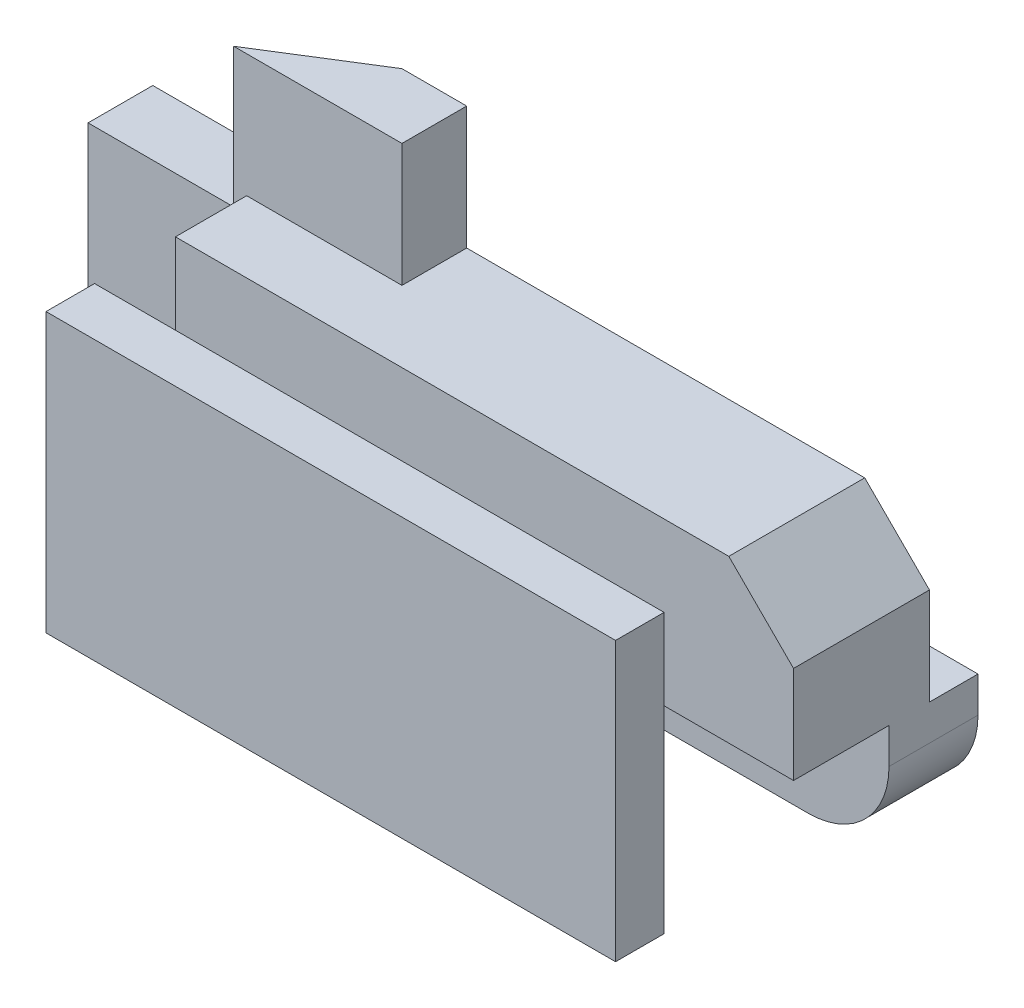
ISO-10303-21;
HEADER;
FILE_DESCRIPTION(('STEP AP214'),'2;1');
FILE_NAME('part.step','',(''),(''),'','','');
FILE_SCHEMA(('AUTOMOTIVE_DESIGN { 1 0 10303 214 1 1 1 1 }'));
ENDSEC;
DATA;
#1=APPLICATION_CONTEXT('core data for automotive mechanical design processes');
#2=APPLICATION_PROTOCOL_DEFINITION('international standard','automotive_design',2000,#1);
#3=PRODUCT_CONTEXT('',#1,'mechanical');
#4=PRODUCT('Part','Part','',(#3));
#5=PRODUCT_RELATED_PRODUCT_CATEGORY('part','',(#4));
#6=PRODUCT_DEFINITION_FORMATION('','',#4);
#7=PRODUCT_DEFINITION_CONTEXT('part definition',#1,'design');
#8=PRODUCT_DEFINITION('design','',#6,#7);
#9=PRODUCT_DEFINITION_SHAPE('','',#8);
#10=(LENGTH_UNIT() NAMED_UNIT(*) SI_UNIT(.MILLI.,.METRE.));
#11=(NAMED_UNIT(*) PLANE_ANGLE_UNIT() SI_UNIT($,.RADIAN.));
#12=(NAMED_UNIT(*) SI_UNIT($,.STERADIAN.) SOLID_ANGLE_UNIT());
#13=UNCERTAINTY_MEASURE_WITH_UNIT(LENGTH_MEASURE(1.E-05),#10,'distance_accuracy_value','');
#14=(GEOMETRIC_REPRESENTATION_CONTEXT(3) GLOBAL_UNCERTAINTY_ASSIGNED_CONTEXT((#13)) GLOBAL_UNIT_ASSIGNED_CONTEXT((#10,
#11,#12)) REPRESENTATION_CONTEXT('',''));
#15=CARTESIAN_POINT('',(0.,0.,0.));
#16=DIRECTION('',(0.,0.,1.));
#17=DIRECTION('',(1.,0.,0.));
#18=AXIS2_PLACEMENT_3D('',#15,#16,#17);
#19=CARTESIAN_POINT('',(0.,0.,4.2));
#20=DIRECTION('',(0.,0.,-1.));
#21=DIRECTION('',(-1.,0.,0.));
#22=AXIS2_PLACEMENT_3D('',#19,#20,#21);
#23=PLANE('',#22);
#24=DIRECTION('',(0.,-1.,0.));
#25=VECTOR('',#24,1.);
#26=CARTESIAN_POINT('',(7.74,1.5,4.2));
#27=LINE('',#26,#25);
#28=CARTESIAN_POINT('',(7.74,4.,4.2));
#29=VERTEX_POINT('',#28);
#30=CARTESIAN_POINT('',(7.74,1.5,4.2));
#31=VERTEX_POINT('',#30);
#32=EDGE_CURVE('E57',#29,#31,#27,.T.);
#33=ORIENTED_EDGE('',*,*,#32,.F.);
#34=DIRECTION('',(-1.,0.,0.));
#35=VECTOR('',#34,1.);
#36=CARTESIAN_POINT('',(7.74,4.,4.2));
#37=LINE('',#36,#35);
#38=CARTESIAN_POINT('',(16.94,4.,4.2));
#39=VERTEX_POINT('',#38);
#40=EDGE_CURVE('E255',#39,#29,#37,.T.);
#41=ORIENTED_EDGE('',*,*,#40,.F.);
#42=DIRECTION('',(0.,1.,0.));
#43=VECTOR('',#42,1.);
#44=CARTESIAN_POINT('',(16.94,1.5,4.2));
#45=LINE('',#44,#43);
#46=CARTESIAN_POINT('',(16.94,1.5,4.2));
#47=VERTEX_POINT('',#46);
#48=EDGE_CURVE('E245',#47,#39,#45,.T.);
#49=ORIENTED_EDGE('',*,*,#48,.F.);
#50=DIRECTION('',(-1.,0.,0.));
#51=VECTOR('',#50,1.);
#52=CARTESIAN_POINT('',(0.,1.5,4.2));
#53=LINE('',#52,#51);
#54=CARTESIAN_POINT('',(24.,1.5,4.2));
#55=VERTEX_POINT('',#54);
#56=EDGE_CURVE('E340',#55,#47,#53,.T.);
#57=ORIENTED_EDGE('',*,*,#56,.F.);
#58=DIRECTION('',(0.,-1.,0.));
#59=VECTOR('',#58,1.);
#60=CARTESIAN_POINT('',(24.,0.,4.2));
#61=LINE('',#60,#59);
#62=CARTESIAN_POINT('',(24.,4.49999999999999,4.2));
#63=VERTEX_POINT('',#62);
#64=EDGE_CURVE('E377',#63,#55,#61,.T.);
#65=ORIENTED_EDGE('',*,*,#64,.F.);
#66=DIRECTION('',(0.707106781186546,-0.707106781186549,0.));
#67=VECTOR('',#66,1.);
#68=CARTESIAN_POINT('',(22.,6.5,4.2));
#69=LINE('',#68,#67);
#70=CARTESIAN_POINT('',(22.,6.5,4.2));
#71=VERTEX_POINT('',#70);
#72=EDGE_CURVE('E12',#63,#71,#69,.F.);
#73=ORIENTED_EDGE('',*,*,#72,.T.);
#74=DIRECTION('',(1.,0.,0.));
#75=VECTOR('',#74,1.);
#76=CARTESIAN_POINT('',(4.5,6.5,4.2));
#77=LINE('',#76,#75);
#78=CARTESIAN_POINT('',(4.9,6.5,4.2));
#79=VERTEX_POINT('',#78);
#80=EDGE_CURVE('E374',#79,#71,#77,.T.);
#81=ORIENTED_EDGE('',*,*,#80,.F.);
#82=DIRECTION('',(0.,1.,0.));
#83=VECTOR('',#82,1.);
#84=CARTESIAN_POINT('',(4.9,1.5,4.2));
#85=LINE('',#84,#83);
#86=CARTESIAN_POINT('',(4.9,1.5,4.2));
#87=VERTEX_POINT('',#86);
#88=EDGE_CURVE('E278',#87,#79,#85,.T.);
#89=ORIENTED_EDGE('',*,*,#88,.F.);
#90=EDGE_CURVE('E62',#31,#87,#53,.T.);
#91=ORIENTED_EDGE('',*,*,#90,.F.);
#92=EDGE_LOOP('',(#33,#41,#49,#57,#65,#73,#81,#89,#91));
#93=FACE_BOUND('',#92,.T.);
#94=ADVANCED_FACE('F41',(#93),#23,.F.);
#95=CARTESIAN_POINT('',(0.,0.,2.));
#96=DIRECTION('',(0.,1.,0.));
#97=DIRECTION('',(0.,0.,1.));
#98=AXIS2_PLACEMENT_3D('',#95,#96,#97);
#99=PLANE('',#98);
#100=DIRECTION('',(0.,0.,-1.));
#101=VECTOR('',#100,1.);
#102=CARTESIAN_POINT('',(14.,0.,14.4181211580212));
#103=LINE('',#102,#101);
#104=CARTESIAN_POINT('',(14.,0.,1.25));
#105=VERTEX_POINT('',#104);
#106=CARTESIAN_POINT('',(14.,0.,0.));
#107=VERTEX_POINT('',#106);
#108=EDGE_CURVE('E369',#105,#107,#103,.T.);
#109=ORIENTED_EDGE('',*,*,#108,.F.);
#110=DIRECTION('',(-1.,0.,0.));
#111=VECTOR('',#110,1.);
#112=CARTESIAN_POINT('',(0.,0.,1.25));
#113=LINE('',#112,#111);
#114=CARTESIAN_POINT('',(0.,0.,1.25));
#115=VERTEX_POINT('',#114);
#116=EDGE_CURVE('E358',#105,#115,#113,.T.);
#117=ORIENTED_EDGE('',*,*,#116,.T.);
#118=DIRECTION('',(0.,0.,-1.));
#119=VECTOR('',#118,1.);
#120=CARTESIAN_POINT('',(0.,0.,2.));
#121=LINE('',#120,#119);
#122=CARTESIAN_POINT('',(0.,0.,0.));
#123=VERTEX_POINT('',#122);
#124=EDGE_CURVE('E399',#115,#123,#121,.T.);
#125=ORIENTED_EDGE('',*,*,#124,.T.);
#126=DIRECTION('',(1.,0.,0.));
#127=VECTOR('',#126,1.);
#128=CARTESIAN_POINT('',(0.,0.,0.));
#129=LINE('',#128,#127);
#130=EDGE_CURVE('E393',#123,#107,#129,.T.);
#131=ORIENTED_EDGE('',*,*,#130,.T.);
#132=EDGE_LOOP('',(#109,#117,#125,#131));
#133=FACE_BOUND('',#132,.T.);
#134=ADVANCED_FACE('F495',(#133),#99,.F.);
#135=CARTESIAN_POINT('',(0.,0.,2.));
#136=DIRECTION('',(1.,0.,0.));
#137=DIRECTION('',(0.,0.,-1.));
#138=AXIS2_PLACEMENT_3D('',#135,#136,#137);
#139=PLANE('',#138);
#140=ORIENTED_EDGE('',*,*,#124,.F.);
#141=DIRECTION('',(0.,-1.,0.));
#142=VECTOR('',#141,1.);
#143=CARTESIAN_POINT('',(0.,1.5,1.25));
#144=LINE('',#143,#142);
#145=CARTESIAN_POINT('',(0.,1.5,1.25));
#146=VERTEX_POINT('',#145);
#147=EDGE_CURVE('E344',#146,#115,#144,.T.);
#148=ORIENTED_EDGE('',*,*,#147,.F.);
#149=DIRECTION('',(0.,0.,1.));
#150=VECTOR('',#149,1.);
#151=CARTESIAN_POINT('',(0.,1.5,-24.268498099388));
#152=LINE('',#151,#150);
#153=CARTESIAN_POINT('',(0.,1.5,2.));
#154=VERTEX_POINT('',#153);
#155=EDGE_CURVE('E347',#146,#154,#152,.T.);
#156=ORIENTED_EDGE('',*,*,#155,.T.);
#157=DIRECTION('',(0.,-1.,0.));
#158=VECTOR('',#157,1.);
#159=CARTESIAN_POINT('',(0.,0.,2.));
#160=LINE('',#159,#158);
#161=CARTESIAN_POINT('',(0.,6.,2.));
#162=VERTEX_POINT('',#161);
#163=EDGE_CURVE('E384',#162,#154,#160,.T.);
#164=ORIENTED_EDGE('',*,*,#163,.F.);
#165=DIRECTION('',(0.,0.,-1.));
#166=VECTOR('',#165,1.);
#167=CARTESIAN_POINT('',(0.,6.,2.));
#168=LINE('',#167,#166);
#169=CARTESIAN_POINT('',(0.,6.,0.));
#170=VERTEX_POINT('',#169);
#171=EDGE_CURVE('E390',#162,#170,#168,.T.);
#172=ORIENTED_EDGE('',*,*,#171,.T.);
#173=DIRECTION('',(0.,-1.,0.));
#174=VECTOR('',#173,1.);
#175=CARTESIAN_POINT('',(0.,0.,0.));
#176=LINE('',#175,#174);
#177=EDGE_CURVE('E380',#170,#123,#176,.T.);
#178=ORIENTED_EDGE('',*,*,#177,.T.);
#179=EDGE_LOOP('',(#140,#148,#156,#164,#172,#178));
#180=FACE_BOUND('',#179,.T.);
#181=ADVANCED_FACE('F499',(#180),#139,.F.);
#182=CARTESIAN_POINT('',(0.,6.,2.));
#183=DIRECTION('',(0.,-1.,0.));
#184=DIRECTION('',(0.,0.,-1.));
#185=AXIS2_PLACEMENT_3D('',#182,#183,#184);
#186=PLANE('',#185);
#187=DIRECTION('',(-1.,0.,0.));
#188=VECTOR('',#187,1.);
#189=CARTESIAN_POINT('',(0.,6.,0.));
#190=LINE('',#189,#188);
#191=CARTESIAN_POINT('',(7.7,6.,0.));
#192=VERTEX_POINT('',#191);
#193=EDGE_CURVE('E388',#192,#170,#190,.T.);
#194=ORIENTED_EDGE('',*,*,#193,.T.);
#195=ORIENTED_EDGE('',*,*,#171,.F.);
#196=DIRECTION('',(-1.,0.,0.));
#197=VECTOR('',#196,1.);
#198=CARTESIAN_POINT('',(0.,6.,2.));
#199=LINE('',#198,#197);
#200=CARTESIAN_POINT('',(4.5,6.,2.));
#201=VERTEX_POINT('',#200);
#202=EDGE_CURVE('E387',#201,#162,#199,.T.);
#203=ORIENTED_EDGE('',*,*,#202,.F.);
#204=DIRECTION('',(0.847998304005088,0.,-0.52999894000318));
#205=VECTOR('',#204,1.);
#206=CARTESIAN_POINT('',(4.5,6.,2.));
#207=LINE('',#206,#205);
#208=EDGE_CURVE('E290',#201,#192,#207,.T.);
#209=ORIENTED_EDGE('',*,*,#208,.T.);
#210=EDGE_LOOP('',(#194,#195,#203,#209));
#211=FACE_BOUND('',#210,.T.);
#212=ADVANCED_FACE('F505',(#211),#186,.F.);
#213=CARTESIAN_POINT('',(0.,0.,2.));
#214=DIRECTION('',(0.,0.,-1.));
#215=DIRECTION('',(-1.,0.,0.));
#216=AXIS2_PLACEMENT_3D('',#213,#214,#215);
#217=PLANE('',#216);
#218=ORIENTED_EDGE('',*,*,#163,.T.);
#219=DIRECTION('',(1.,0.,0.));
#220=VECTOR('',#219,1.);
#221=CARTESIAN_POINT('',(0.,1.5,2.));
#222=LINE('',#221,#220);
#223=CARTESIAN_POINT('',(4.9,1.5,2.));
#224=VERTEX_POINT('',#223);
#225=EDGE_CURVE('E361',#154,#224,#222,.T.);
#226=ORIENTED_EDGE('',*,*,#225,.T.);
#227=DIRECTION('',(0.,1.,0.));
#228=VECTOR('',#227,1.);
#229=CARTESIAN_POINT('',(4.9,1.5,2.));
#230=LINE('',#229,#228);
#231=CARTESIAN_POINT('',(4.9,6.5,2.));
#232=VERTEX_POINT('',#231);
#233=EDGE_CURVE('E281',#224,#232,#230,.T.);
#234=ORIENTED_EDGE('',*,*,#233,.T.);
#235=DIRECTION('',(-1.,0.,0.));
#236=VECTOR('',#235,1.);
#237=CARTESIAN_POINT('',(4.5,6.5,2.));
#238=LINE('',#237,#236);
#239=CARTESIAN_POINT('',(9.7,6.5,2.));
#240=VERTEX_POINT('',#239);
#241=EDGE_CURVE('E305',#240,#232,#238,.T.);
#242=ORIENTED_EDGE('',*,*,#241,.F.);
#243=DIRECTION('',(0.,-1.,0.));
#244=VECTOR('',#243,1.);
#245=CARTESIAN_POINT('',(9.7,6.5,2.));
#246=LINE('',#245,#244);
#247=CARTESIAN_POINT('',(9.7,10.3,2.));
#248=VERTEX_POINT('',#247);
#249=EDGE_CURVE('E303',#248,#240,#246,.T.);
#250=ORIENTED_EDGE('',*,*,#249,.F.);
#251=DIRECTION('',(1.,0.,0.));
#252=VECTOR('',#251,1.);
#253=CARTESIAN_POINT('',(4.5,10.3,2.));
#254=LINE('',#253,#252);
#255=CARTESIAN_POINT('',(4.5,10.3,2.));
#256=VERTEX_POINT('',#255);
#257=EDGE_CURVE('E299',#256,#248,#254,.T.);
#258=ORIENTED_EDGE('',*,*,#257,.F.);
#259=DIRECTION('',(0.,1.,0.));
#260=VECTOR('',#259,1.);
#261=CARTESIAN_POINT('',(4.5,6.5,2.));
#262=LINE('',#261,#260);
#263=EDGE_CURVE('E297',#201,#256,#262,.T.);
#264=ORIENTED_EDGE('',*,*,#263,.F.);
#265=ORIENTED_EDGE('',*,*,#202,.T.);
#266=EDGE_LOOP('',(#218,#226,#234,#242,#250,#258,#264,#265));
#267=FACE_BOUND('',#266,.T.);
#268=ADVANCED_FACE('F442',(#267),#217,.F.);
#269=CARTESIAN_POINT('',(0.,0.,0.));
#270=DIRECTION('',(0.,0.,-1.));
#271=DIRECTION('',(-1.,0.,0.));
#272=AXIS2_PLACEMENT_3D('',#269,#270,#271);
#273=PLANE('',#272);
#274=DIRECTION('',(1.,0.,0.));
#275=VECTOR('',#274,1.);
#276=CARTESIAN_POINT('',(4.5,6.5,0.));
#277=LINE('',#276,#275);
#278=CARTESIAN_POINT('',(9.7,6.5,0.));
#279=VERTEX_POINT('',#278);
#280=CARTESIAN_POINT('',(22.,6.5,0.));
#281=VERTEX_POINT('',#280);
#282=EDGE_CURVE('E371',#279,#281,#277,.T.);
#283=ORIENTED_EDGE('',*,*,#282,.T.);
#284=DIRECTION('',(-0.707106781186546,0.707106781186549,0.));
#285=VECTOR('',#284,1.);
#286=CARTESIAN_POINT('',(14.25,14.25,0.));
#287=LINE('',#286,#285);
#288=CARTESIAN_POINT('',(24.,4.49999999999999,0.));
#289=VERTEX_POINT('',#288);
#290=EDGE_CURVE('E416',#281,#289,#287,.F.);
#291=ORIENTED_EDGE('',*,*,#290,.T.);
#292=DIRECTION('',(0.,-1.,0.));
#293=VECTOR('',#292,1.);
#294=CARTESIAN_POINT('',(24.,0.,0.));
#295=LINE('',#294,#293);
#296=CARTESIAN_POINT('',(24.,1.5,0.));
#297=VERTEX_POINT('',#296);
#298=EDGE_CURVE('E378',#289,#297,#295,.T.);
#299=ORIENTED_EDGE('',*,*,#298,.T.);
#300=DIRECTION('',(1.,0.,0.));
#301=VECTOR('',#300,1.);
#302=CARTESIAN_POINT('',(24.,1.5,0.));
#303=LINE('',#302,#301);
#304=CARTESIAN_POINT('',(19.5,1.5,0.));
#305=VERTEX_POINT('',#304);
#306=EDGE_CURVE('E321',#305,#297,#303,.T.);
#307=ORIENTED_EDGE('',*,*,#306,.F.);
#308=DIRECTION('',(0.,1.,0.));
#309=VECTOR('',#308,1.);
#310=CARTESIAN_POINT('',(19.5,-2.1,0.));
#311=LINE('',#310,#309);
#312=CARTESIAN_POINT('',(19.5,-2.1,0.));
#313=VERTEX_POINT('',#312);
#314=EDGE_CURVE('E314',#313,#305,#311,.T.);
#315=ORIENTED_EDGE('',*,*,#314,.F.);
#316=DIRECTION('',(-1.,0.,0.));
#317=VECTOR('',#316,1.);
#318=CARTESIAN_POINT('',(24.,-2.1,0.));
#319=LINE('',#318,#317);
#320=CARTESIAN_POINT('',(14.,-2.1,0.));
#321=VERTEX_POINT('',#320);
#322=EDGE_CURVE('E363',#313,#321,#319,.T.);
#323=ORIENTED_EDGE('',*,*,#322,.T.);
#324=DIRECTION('',(0.,1.,0.));
#325=VECTOR('',#324,1.);
#326=CARTESIAN_POINT('',(14.,0.,0.));
#327=LINE('',#326,#325);
#328=EDGE_CURVE('E365',#321,#107,#327,.T.);
#329=ORIENTED_EDGE('',*,*,#328,.T.);
#330=ORIENTED_EDGE('',*,*,#130,.F.);
#331=ORIENTED_EDGE('',*,*,#177,.F.);
#332=ORIENTED_EDGE('',*,*,#193,.F.);
#333=DIRECTION('',(0.,1.,0.));
#334=VECTOR('',#333,1.);
#335=CARTESIAN_POINT('',(7.7,2.22640754717736,0.));
#336=LINE('',#335,#334);
#337=CARTESIAN_POINT('',(7.7,10.3,0.));
#338=VERTEX_POINT('',#337);
#339=EDGE_CURVE('E293',#192,#338,#336,.T.);
#340=ORIENTED_EDGE('',*,*,#339,.T.);
#341=DIRECTION('',(1.,0.,0.));
#342=VECTOR('',#341,1.);
#343=CARTESIAN_POINT('',(4.5,10.3,0.));
#344=LINE('',#343,#342);
#345=CARTESIAN_POINT('',(9.7,10.3,0.));
#346=VERTEX_POINT('',#345);
#347=EDGE_CURVE('E296',#338,#346,#344,.T.);
#348=ORIENTED_EDGE('',*,*,#347,.T.);
#349=DIRECTION('',(0.,-1.,0.));
#350=VECTOR('',#349,1.);
#351=CARTESIAN_POINT('',(9.7,6.5,0.));
#352=LINE('',#351,#350);
#353=EDGE_CURVE('E300',#346,#279,#352,.T.);
#354=ORIENTED_EDGE('',*,*,#353,.T.);
#355=EDGE_LOOP('',(#283,#291,#299,#307,#315,#323,#329,#330,#331,#332,#340,#348,#354));
#356=FACE_BOUND('',#355,.T.);
#357=ADVANCED_FACE('F433',(#356),#273,.T.);
#358=CARTESIAN_POINT('',(24.,0.,4.2));
#359=DIRECTION('',(1.,0.,0.));
#360=DIRECTION('',(0.,0.,-1.));
#361=AXIS2_PLACEMENT_3D('',#358,#359,#360);
#362=PLANE('',#361);
#363=ORIENTED_EDGE('',*,*,#298,.F.);
#364=DIRECTION('',(0.,0.,1.));
#365=VECTOR('',#364,1.);
#366=CARTESIAN_POINT('',(24.,4.49999999999999,4.2));
#367=LINE('',#366,#365);
#368=EDGE_CURVE('E50',#289,#63,#367,.T.);
#369=ORIENTED_EDGE('',*,*,#368,.T.);
#370=ORIENTED_EDGE('',*,*,#64,.T.);
#371=DIRECTION('',(0.,0.,1.));
#372=VECTOR('',#371,1.);
#373=CARTESIAN_POINT('',(24.,1.5,-24.268498099388));
#374=LINE('',#373,#372);
#375=CARTESIAN_POINT('',(24.,1.5,1.25));
#376=VERTEX_POINT('',#375);
#377=EDGE_CURVE('E351',#376,#55,#374,.T.);
#378=ORIENTED_EDGE('',*,*,#377,.F.);
#379=DIRECTION('',(0.,1.,0.));
#380=VECTOR('',#379,1.);
#381=CARTESIAN_POINT('',(24.,1.5,1.25));
#382=LINE('',#381,#380);
#383=CARTESIAN_POINT('',(24.,0.4,1.25));
#384=VERTEX_POINT('',#383);
#385=EDGE_CURVE('E343',#384,#376,#382,.T.);
#386=ORIENTED_EDGE('',*,*,#385,.F.);
#387=DIRECTION('',(0.,0.,-1.));
#388=VECTOR('',#387,1.);
#389=CARTESIAN_POINT('',(24.,0.4,4.2));
#390=LINE('',#389,#388);
#391=CARTESIAN_POINT('',(24.,0.4,-1.5));
#392=VERTEX_POINT('',#391);
#393=EDGE_CURVE('E404',#384,#392,#390,.T.);
#394=ORIENTED_EDGE('',*,*,#393,.T.);
#395=DIRECTION('',(0.,-1.,0.));
#396=VECTOR('',#395,1.);
#397=CARTESIAN_POINT('',(24.,-2.1,-1.5));
#398=LINE('',#397,#396);
#399=CARTESIAN_POINT('',(24.,1.5,-1.5));
#400=VERTEX_POINT('',#399);
#401=EDGE_CURVE('E317',#400,#392,#398,.T.);
#402=ORIENTED_EDGE('',*,*,#401,.F.);
#403=DIRECTION('',(0.,0.,1.));
#404=VECTOR('',#403,1.);
#405=CARTESIAN_POINT('',(24.,1.5,-1.5));
#406=LINE('',#405,#404);
#407=EDGE_CURVE('E327',#400,#297,#406,.T.);
#408=ORIENTED_EDGE('',*,*,#407,.T.);
#409=EDGE_LOOP('',(#363,#369,#370,#378,#386,#394,#402,#408));
#410=FACE_BOUND('',#409,.T.);
#411=ADVANCED_FACE('F421',(#410),#362,.T.);
#412=CARTESIAN_POINT('',(4.5,6.5,4.2));
#413=DIRECTION('',(0.,1.,0.));
#414=DIRECTION('',(-1.,0.,0.));
#415=AXIS2_PLACEMENT_3D('',#412,#413,#414);
#416=PLANE('',#415);
#417=ORIENTED_EDGE('',*,*,#80,.T.);
#418=DIRECTION('',(0.,0.,-1.));
#419=VECTOR('',#418,1.);
#420=CARTESIAN_POINT('',(22.,6.5,4.2));
#421=LINE('',#420,#419);
#422=EDGE_CURVE('E413',#71,#281,#421,.T.);
#423=ORIENTED_EDGE('',*,*,#422,.T.);
#424=ORIENTED_EDGE('',*,*,#282,.F.);
#425=DIRECTION('',(0.,0.,-1.));
#426=VECTOR('',#425,1.);
#427=CARTESIAN_POINT('',(9.7,6.5,2.));
#428=LINE('',#427,#426);
#429=EDGE_CURVE('E312',#240,#279,#428,.T.);
#430=ORIENTED_EDGE('',*,*,#429,.F.);
#431=ORIENTED_EDGE('',*,*,#241,.T.);
#432=DIRECTION('',(0.,0.,1.));
#433=VECTOR('',#432,1.);
#434=CARTESIAN_POINT('',(4.9,6.5,-3.01597448159378));
#435=LINE('',#434,#433);
#436=EDGE_CURVE('E283',#232,#79,#435,.T.);
#437=ORIENTED_EDGE('',*,*,#436,.T.);
#438=EDGE_LOOP('',(#417,#423,#424,#430,#431,#437));
#439=FACE_BOUND('',#438,.T.);
#440=ADVANCED_FACE('F430',(#439),#416,.T.);
#441=CARTESIAN_POINT('',(14.,0.,14.4181211580212));
#442=DIRECTION('',(-1.,0.,0.));
#443=DIRECTION('',(0.,0.,1.));
#444=AXIS2_PLACEMENT_3D('',#441,#442,#443);
#445=PLANE('',#444);
#446=DIRECTION('',(0.,-1.,0.));
#447=VECTOR('',#446,1.);
#448=CARTESIAN_POINT('',(14.,0.,1.25));
#449=LINE('',#448,#447);
#450=CARTESIAN_POINT('',(14.,-2.1,1.25));
#451=VERTEX_POINT('',#450);
#452=EDGE_CURVE('E346',#105,#451,#449,.T.);
#453=ORIENTED_EDGE('',*,*,#452,.F.);
#454=ORIENTED_EDGE('',*,*,#108,.T.);
#455=ORIENTED_EDGE('',*,*,#328,.F.);
#456=DIRECTION('',(0.,0.,-1.));
#457=VECTOR('',#456,1.);
#458=CARTESIAN_POINT('',(14.,-2.1,14.4181211580212));
#459=LINE('',#458,#457);
#460=EDGE_CURVE('E368',#451,#321,#459,.T.);
#461=ORIENTED_EDGE('',*,*,#460,.F.);
#462=EDGE_LOOP('',(#453,#454,#455,#461));
#463=FACE_BOUND('',#462,.T.);
#464=ADVANCED_FACE('F492',(#463),#445,.T.);
#465=CARTESIAN_POINT('',(24.,-2.1,14.4181211580212));
#466=DIRECTION('',(0.,-1.,0.));
#467=DIRECTION('',(0.,0.,-1.));
#468=AXIS2_PLACEMENT_3D('',#465,#466,#467);
#469=PLANE('',#468);
#470=DIRECTION('',(-1.,0.,0.));
#471=VECTOR('',#470,1.);
#472=CARTESIAN_POINT('',(24.,-2.1,-1.5));
#473=LINE('',#472,#471);
#474=CARTESIAN_POINT('',(21.5,-2.1,-1.5));
#475=VERTEX_POINT('',#474);
#476=CARTESIAN_POINT('',(19.5,-2.1,-1.5));
#477=VERTEX_POINT('',#476);
#478=EDGE_CURVE('E320',#475,#477,#473,.T.);
#479=ORIENTED_EDGE('',*,*,#478,.F.);
#480=DIRECTION('',(0.,0.,-1.));
#481=VECTOR('',#480,1.);
#482=CARTESIAN_POINT('',(21.5,-2.1,14.4181211580212));
#483=LINE('',#482,#481);
#484=CARTESIAN_POINT('',(21.5,-2.1,1.25));
#485=VERTEX_POINT('',#484);
#486=EDGE_CURVE('E409',#475,#485,#483,.F.);
#487=ORIENTED_EDGE('',*,*,#486,.T.);
#488=DIRECTION('',(1.,0.,0.));
#489=VECTOR('',#488,1.);
#490=CARTESIAN_POINT('',(24.,-2.1,1.25));
#491=LINE('',#490,#489);
#492=EDGE_CURVE('E401',#451,#485,#491,.T.);
#493=ORIENTED_EDGE('',*,*,#492,.F.);
#494=ORIENTED_EDGE('',*,*,#460,.T.);
#495=ORIENTED_EDGE('',*,*,#322,.F.);
#496=DIRECTION('',(0.,0.,1.));
#497=VECTOR('',#496,1.);
#498=CARTESIAN_POINT('',(19.5,-2.1,-1.5));
#499=LINE('',#498,#497);
#500=EDGE_CURVE('E337',#477,#313,#499,.T.);
#501=ORIENTED_EDGE('',*,*,#500,.F.);
#502=EDGE_LOOP('',(#479,#487,#493,#494,#495,#501));
#503=FACE_BOUND('',#502,.T.);
#504=ADVANCED_FACE('F476',(#503),#469,.T.);
#505=CARTESIAN_POINT('',(0.,1.5,-24.268498099388));
#506=DIRECTION('',(0.,1.,0.));
#507=DIRECTION('',(-1.,0.,0.));
#508=AXIS2_PLACEMENT_3D('',#505,#506,#507);
#509=PLANE('',#508);
#510=DIRECTION('',(0.,0.,1.));
#511=VECTOR('',#510,1.);
#512=CARTESIAN_POINT('',(4.9,1.5,-3.01597448159378));
#513=LINE('',#512,#511);
#514=EDGE_CURVE('E280',#224,#87,#513,.T.);
#515=ORIENTED_EDGE('',*,*,#514,.F.);
#516=ORIENTED_EDGE('',*,*,#225,.F.);
#517=ORIENTED_EDGE('',*,*,#155,.F.);
#518=DIRECTION('',(-1.,0.,0.));
#519=VECTOR('',#518,1.);
#520=CARTESIAN_POINT('',(0.,1.5,1.25));
#521=LINE('',#520,#519);
#522=EDGE_CURVE('E348',#376,#146,#521,.T.);
#523=ORIENTED_EDGE('',*,*,#522,.F.);
#524=ORIENTED_EDGE('',*,*,#377,.T.);
#525=ORIENTED_EDGE('',*,*,#56,.T.);
#526=DIRECTION('',(0.,0.,-1.));
#527=VECTOR('',#526,1.);
#528=CARTESIAN_POINT('',(16.94,1.5,6.7));
#529=LINE('',#528,#527);
#530=CARTESIAN_POINT('',(16.94,1.5,6.7));
#531=VERTEX_POINT('',#530);
#532=EDGE_CURVE('E273',#531,#47,#529,.T.);
#533=ORIENTED_EDGE('',*,*,#532,.F.);
#534=DIRECTION('',(1.,0.,0.));
#535=VECTOR('',#534,1.);
#536=CARTESIAN_POINT('',(7.74,1.5,6.7));
#537=LINE('',#536,#535);
#538=CARTESIAN_POINT('',(7.74,1.5,6.7));
#539=VERTEX_POINT('',#538);
#540=EDGE_CURVE('E254',#539,#531,#537,.T.);
#541=ORIENTED_EDGE('',*,*,#540,.F.);
#542=DIRECTION('',(0.,0.,-1.));
#543=VECTOR('',#542,1.);
#544=CARTESIAN_POINT('',(7.74,1.5,6.7));
#545=LINE('',#544,#543);
#546=EDGE_CURVE('E276',#539,#31,#545,.T.);
#547=ORIENTED_EDGE('',*,*,#546,.T.);
#548=ORIENTED_EDGE('',*,*,#90,.T.);
#549=EDGE_LOOP('',(#515,#516,#517,#523,#524,#525,#533,#541,#547,#548));
#550=FACE_BOUND('',#549,.T.);
#551=ADVANCED_FACE('F449',(#550),#509,.F.);
#552=CARTESIAN_POINT('',(0.,0.,1.25));
#553=DIRECTION('',(0.,0.,-1.));
#554=DIRECTION('',(-1.,0.,0.));
#555=AXIS2_PLACEMENT_3D('',#552,#553,#554);
#556=PLANE('',#555);
#557=ORIENTED_EDGE('',*,*,#492,.T.);
#558=CARTESIAN_POINT('',(21.5,0.4,1.25));
#559=DIRECTION('',(0.,0.,-1.));
#560=DIRECTION('',(-1.,0.,0.));
#561=AXIS2_PLACEMENT_3D('',#558,#559,#560);
#562=CIRCLE('',#561,2.5);
#563=EDGE_CURVE('E411',#485,#384,#562,.F.);
#564=ORIENTED_EDGE('',*,*,#563,.T.);
#565=ORIENTED_EDGE('',*,*,#385,.T.);
#566=ORIENTED_EDGE('',*,*,#522,.T.);
#567=ORIENTED_EDGE('',*,*,#147,.T.);
#568=ORIENTED_EDGE('',*,*,#116,.F.);
#569=ORIENTED_EDGE('',*,*,#452,.T.);
#570=EDGE_LOOP('',(#557,#564,#565,#566,#567,#568,#569));
#571=FACE_BOUND('',#570,.T.);
#572=ADVANCED_FACE('F631',(#571),#556,.F.);
#573=CARTESIAN_POINT('',(19.5,-2.1,-1.5));
#574=DIRECTION('',(1.,0.,0.));
#575=DIRECTION('',(0.,0.,-1.));
#576=AXIS2_PLACEMENT_3D('',#573,#574,#575);
#577=PLANE('',#576);
#578=ORIENTED_EDGE('',*,*,#314,.T.);
#579=DIRECTION('',(0.,0.,1.));
#580=VECTOR('',#579,1.);
#581=CARTESIAN_POINT('',(19.5,1.5,-1.5));
#582=LINE('',#581,#580);
#583=CARTESIAN_POINT('',(19.5,1.5,-1.5));
#584=VERTEX_POINT('',#583);
#585=EDGE_CURVE('E334',#584,#305,#582,.T.);
#586=ORIENTED_EDGE('',*,*,#585,.F.);
#587=DIRECTION('',(0.,1.,0.));
#588=VECTOR('',#587,1.);
#589=CARTESIAN_POINT('',(19.5,-2.1,-1.5));
#590=LINE('',#589,#588);
#591=EDGE_CURVE('E323',#477,#584,#590,.T.);
#592=ORIENTED_EDGE('',*,*,#591,.F.);
#593=ORIENTED_EDGE('',*,*,#500,.T.);
#594=EDGE_LOOP('',(#578,#586,#592,#593));
#595=FACE_BOUND('',#594,.T.);
#596=ADVANCED_FACE('F482',(#595),#577,.F.);
#597=CARTESIAN_POINT('',(24.,1.5,-1.5));
#598=DIRECTION('',(0.,-1.,0.));
#599=DIRECTION('',(0.,0.,-1.));
#600=AXIS2_PLACEMENT_3D('',#597,#598,#599);
#601=PLANE('',#600);
#602=ORIENTED_EDGE('',*,*,#306,.T.);
#603=ORIENTED_EDGE('',*,*,#407,.F.);
#604=DIRECTION('',(1.,0.,0.));
#605=VECTOR('',#604,1.);
#606=CARTESIAN_POINT('',(24.,1.5,-1.5));
#607=LINE('',#606,#605);
#608=EDGE_CURVE('E325',#584,#400,#607,.T.);
#609=ORIENTED_EDGE('',*,*,#608,.F.);
#610=ORIENTED_EDGE('',*,*,#585,.T.);
#611=EDGE_LOOP('',(#602,#603,#609,#610));
#612=FACE_BOUND('',#611,.T.);
#613=ADVANCED_FACE('F486',(#612),#601,.F.);
#614=CARTESIAN_POINT('',(0.,0.,-1.5));
#615=DIRECTION('',(0.,0.,1.));
#616=DIRECTION('',(1.,0.,0.));
#617=AXIS2_PLACEMENT_3D('',#614,#615,#616);
#618=PLANE('',#617);
#619=ORIENTED_EDGE('',*,*,#401,.T.);
#620=CARTESIAN_POINT('',(21.5,0.4,-1.5));
#621=DIRECTION('',(0.,0.,1.));
#622=DIRECTION('',(1.,0.,0.));
#623=AXIS2_PLACEMENT_3D('',#620,#621,#622);
#624=CIRCLE('',#623,2.5);
#625=EDGE_CURVE('E407',#392,#475,#624,.F.);
#626=ORIENTED_EDGE('',*,*,#625,.T.);
#627=ORIENTED_EDGE('',*,*,#478,.T.);
#628=ORIENTED_EDGE('',*,*,#591,.T.);
#629=ORIENTED_EDGE('',*,*,#608,.T.);
#630=EDGE_LOOP('',(#619,#626,#627,#628,#629));
#631=FACE_BOUND('',#630,.T.);
#632=ADVANCED_FACE('F473',(#631),#618,.F.);
#633=CARTESIAN_POINT('',(9.7,6.5,2.));
#634=DIRECTION('',(1.,0.,0.));
#635=DIRECTION('',(0.,0.,-1.));
#636=AXIS2_PLACEMENT_3D('',#633,#634,#635);
#637=PLANE('',#636);
#638=ORIENTED_EDGE('',*,*,#353,.F.);
#639=DIRECTION('',(0.,0.,-1.));
#640=VECTOR('',#639,1.);
#641=CARTESIAN_POINT('',(9.7,10.3,2.));
#642=LINE('',#641,#640);
#643=EDGE_CURVE('E308',#248,#346,#642,.T.);
#644=ORIENTED_EDGE('',*,*,#643,.F.);
#645=ORIENTED_EDGE('',*,*,#249,.T.);
#646=ORIENTED_EDGE('',*,*,#429,.T.);
#647=EDGE_LOOP('',(#638,#644,#645,#646));
#648=FACE_BOUND('',#647,.T.);
#649=ADVANCED_FACE('F437',(#648),#637,.T.);
#650=CARTESIAN_POINT('',(4.5,10.3,2.));
#651=DIRECTION('',(0.,1.,0.));
#652=DIRECTION('',(-1.,0.,0.));
#653=AXIS2_PLACEMENT_3D('',#650,#651,#652);
#654=PLANE('',#653);
#655=DIRECTION('',(0.847998304005088,0.,-0.52999894000318));
#656=VECTOR('',#655,1.);
#657=CARTESIAN_POINT('',(4.5,10.3,2.));
#658=LINE('',#657,#656);
#659=EDGE_CURVE('E288',#256,#338,#658,.T.);
#660=ORIENTED_EDGE('',*,*,#659,.F.);
#661=ORIENTED_EDGE('',*,*,#257,.T.);
#662=ORIENTED_EDGE('',*,*,#643,.T.);
#663=ORIENTED_EDGE('',*,*,#347,.F.);
#664=EDGE_LOOP('',(#660,#661,#662,#663));
#665=FACE_BOUND('',#664,.T.);
#666=ADVANCED_FACE('F512',(#665),#654,.T.);
#667=CARTESIAN_POINT('',(4.5,2.22640754717736,2.));
#668=DIRECTION('',(0.52999894000318,0.,0.847998304005088));
#669=DIRECTION('',(0.847998304005088,0.,-0.52999894000318));
#670=AXIS2_PLACEMENT_3D('',#667,#668,#669);
#671=PLANE('',#670);
#672=ORIENTED_EDGE('',*,*,#208,.F.);
#673=ORIENTED_EDGE('',*,*,#263,.T.);
#674=ORIENTED_EDGE('',*,*,#659,.T.);
#675=ORIENTED_EDGE('',*,*,#339,.F.);
#676=EDGE_LOOP('',(#672,#673,#674,#675));
#677=FACE_BOUND('',#676,.T.);
#678=ADVANCED_FACE('F509',(#677),#671,.F.);
#679=CARTESIAN_POINT('',(4.9,1.5,-3.01597448159378));
#680=DIRECTION('',(1.,0.,0.));
#681=DIRECTION('',(0.,1.,0.));
#682=AXIS2_PLACEMENT_3D('',#679,#680,#681);
#683=PLANE('',#682);
#684=ORIENTED_EDGE('',*,*,#514,.T.);
#685=ORIENTED_EDGE('',*,*,#88,.T.);
#686=ORIENTED_EDGE('',*,*,#436,.F.);
#687=ORIENTED_EDGE('',*,*,#233,.F.);
#688=EDGE_LOOP('',(#684,#685,#686,#687));
#689=FACE_BOUND('',#688,.T.);
#690=ADVANCED_FACE('F447',(#689),#683,.F.);
#691=CARTESIAN_POINT('',(21.5,0.4,4.2));
#692=DIRECTION('',(0.,0.,-1.));
#693=DIRECTION('',(-1.,0.,0.));
#694=AXIS2_PLACEMENT_3D('',#691,#692,#693);
#695=CYLINDRICAL_SURFACE('',#694,2.5);
#696=ORIENTED_EDGE('',*,*,#563,.F.);
#697=ORIENTED_EDGE('',*,*,#486,.F.);
#698=ORIENTED_EDGE('',*,*,#625,.F.);
#699=ORIENTED_EDGE('',*,*,#393,.F.);
#700=EDGE_LOOP('',(#696,#697,#698,#699));
#701=FACE_BOUND('',#700,.T.);
#702=ADVANCED_FACE('F469',(#701),#695,.T.);
#703=CARTESIAN_POINT('',(22.,6.5,4.2));
#704=DIRECTION('',(-0.707106781186549,-0.707106781186546,0.));
#705=DIRECTION('',(0.,0.,-1.));
#706=AXIS2_PLACEMENT_3D('',#703,#704,#705);
#707=PLANE('',#706);
#708=ORIENTED_EDGE('',*,*,#72,.F.);
#709=ORIENTED_EDGE('',*,*,#368,.F.);
#710=ORIENTED_EDGE('',*,*,#290,.F.);
#711=ORIENTED_EDGE('',*,*,#422,.F.);
#712=EDGE_LOOP('',(#708,#709,#710,#711));
#713=FACE_BOUND('',#712,.T.);
#714=ADVANCED_FACE('F44',(#713),#707,.F.);
#715=CARTESIAN_POINT('',(7.74,1.5,6.7));
#716=DIRECTION('',(1.,0.,0.));
#717=DIRECTION('',(0.,0.,-1.));
#718=AXIS2_PLACEMENT_3D('',#715,#716,#717);
#719=PLANE('',#718);
#720=ORIENTED_EDGE('',*,*,#32,.T.);
#721=ORIENTED_EDGE('',*,*,#546,.F.);
#722=DIRECTION('',(0.,-1.,0.));
#723=VECTOR('',#722,1.);
#724=CARTESIAN_POINT('',(7.74,1.5,6.7));
#725=LINE('',#724,#723);
#726=CARTESIAN_POINT('',(7.74,4.,6.7));
#727=VERTEX_POINT('',#726);
#728=EDGE_CURVE('E251',#727,#539,#725,.T.);
#729=ORIENTED_EDGE('',*,*,#728,.F.);
#730=DIRECTION('',(0.,0.,-1.));
#731=VECTOR('',#730,1.);
#732=CARTESIAN_POINT('',(7.74,4.,6.7));
#733=LINE('',#732,#731);
#734=EDGE_CURVE('E263',#727,#29,#733,.T.);
#735=ORIENTED_EDGE('',*,*,#734,.T.);
#736=EDGE_LOOP('',(#720,#721,#729,#735));
#737=FACE_BOUND('',#736,.T.);
#738=ADVANCED_FACE('F452',(#737),#719,.F.);
#739=CARTESIAN_POINT('',(16.94,1.5,6.7));
#740=DIRECTION('',(-1.,0.,0.));
#741=DIRECTION('',(0.,0.,1.));
#742=AXIS2_PLACEMENT_3D('',#739,#740,#741);
#743=PLANE('',#742);
#744=ORIENTED_EDGE('',*,*,#48,.T.);
#745=DIRECTION('',(0.,0.,-1.));
#746=VECTOR('',#745,1.);
#747=CARTESIAN_POINT('',(16.94,4.,6.7));
#748=LINE('',#747,#746);
#749=CARTESIAN_POINT('',(16.94,4.,6.7));
#750=VERTEX_POINT('',#749);
#751=EDGE_CURVE('E270',#750,#39,#748,.T.);
#752=ORIENTED_EDGE('',*,*,#751,.F.);
#753=DIRECTION('',(0.,1.,0.));
#754=VECTOR('',#753,1.);
#755=CARTESIAN_POINT('',(16.94,1.5,6.7));
#756=LINE('',#755,#754);
#757=EDGE_CURVE('E258',#531,#750,#756,.T.);
#758=ORIENTED_EDGE('',*,*,#757,.F.);
#759=ORIENTED_EDGE('',*,*,#532,.T.);
#760=EDGE_LOOP('',(#744,#752,#758,#759));
#761=FACE_BOUND('',#760,.T.);
#762=ADVANCED_FACE('F461',(#761),#743,.F.);
#763=CARTESIAN_POINT('',(7.74,4.,6.7));
#764=DIRECTION('',(0.,-1.,0.));
#765=DIRECTION('',(0.,0.,-1.));
#766=AXIS2_PLACEMENT_3D('',#763,#764,#765);
#767=PLANE('',#766);
#768=ORIENTED_EDGE('',*,*,#40,.T.);
#769=ORIENTED_EDGE('',*,*,#734,.F.);
#770=DIRECTION('',(-1.,0.,0.));
#771=VECTOR('',#770,1.);
#772=CARTESIAN_POINT('',(7.74,4.,6.7));
#773=LINE('',#772,#771);
#774=EDGE_CURVE('E261',#750,#727,#773,.T.);
#775=ORIENTED_EDGE('',*,*,#774,.F.);
#776=ORIENTED_EDGE('',*,*,#751,.T.);
#777=EDGE_LOOP('',(#768,#769,#775,#776));
#778=FACE_BOUND('',#777,.T.);
#779=ADVANCED_FACE('F456',(#778),#767,.F.);
#780=CARTESIAN_POINT('',(0.,0.,6.7));
#781=DIRECTION('',(0.,0.,1.));
#782=DIRECTION('',(1.,0.,0.));
#783=AXIS2_PLACEMENT_3D('',#780,#781,#782);
#784=PLANE('',#783);
#785=DIRECTION('',(0.,-1.,0.));
#786=VECTOR('',#785,1.);
#787=CARTESIAN_POINT('',(4.9,6.5,6.7));
#788=LINE('',#787,#786);
#789=CARTESIAN_POINT('',(4.9,6.5,6.7));
#790=VERTEX_POINT('',#789);
#791=CARTESIAN_POINT('',(4.9,-2.1,6.7));
#792=VERTEX_POINT('',#791);
#793=EDGE_CURVE('E243',#790,#792,#788,.T.);
#794=ORIENTED_EDGE('',*,*,#793,.F.);
#795=DIRECTION('',(-1.,0.,0.));
#796=VECTOR('',#795,1.);
#797=CARTESIAN_POINT('',(4.9,6.5,6.7));
#798=LINE('',#797,#796);
#799=CARTESIAN_POINT('',(22.5,6.5,6.7));
#800=VERTEX_POINT('',#799);
#801=EDGE_CURVE('E239',#800,#790,#798,.T.);
#802=ORIENTED_EDGE('',*,*,#801,.F.);
#803=DIRECTION('',(0.,1.,0.));
#804=VECTOR('',#803,1.);
#805=CARTESIAN_POINT('',(22.5,6.5,6.7));
#806=LINE('',#805,#804);
#807=CARTESIAN_POINT('',(22.5,-2.1,6.7));
#808=VERTEX_POINT('',#807);
#809=EDGE_CURVE('E857',#808,#800,#806,.T.);
#810=ORIENTED_EDGE('',*,*,#809,.F.);
#811=DIRECTION('',(1.,0.,0.));
#812=VECTOR('',#811,1.);
#813=CARTESIAN_POINT('',(4.9,-2.1,6.7));
#814=LINE('',#813,#812);
#815=EDGE_CURVE('E855',#792,#808,#814,.T.);
#816=ORIENTED_EDGE('',*,*,#815,.F.);
#817=EDGE_LOOP('',(#794,#802,#810,#816));
#818=FACE_BOUND('',#817,.T.);
#819=ORIENTED_EDGE('',*,*,#774,.T.);
#820=ORIENTED_EDGE('',*,*,#728,.T.);
#821=ORIENTED_EDGE('',*,*,#540,.T.);
#822=ORIENTED_EDGE('',*,*,#757,.T.);
#823=EDGE_LOOP('',(#819,#820,#821,#822));
#824=FACE_BOUND('',#823,.T.);
#825=ADVANCED_FACE('F458',(#818,#824),#784,.F.);
#826=CARTESIAN_POINT('',(4.9,6.5,8.2));
#827=DIRECTION('',(1.,0.,0.));
#828=DIRECTION('',(0.,1.,0.));
#829=AXIS2_PLACEMENT_3D('',#826,#827,#828);
#830=PLANE('',#829);
#831=ORIENTED_EDGE('',*,*,#793,.T.);
#832=DIRECTION('',(0.,0.,-1.));
#833=VECTOR('',#832,1.);
#834=CARTESIAN_POINT('',(4.9,-2.1,8.2));
#835=LINE('',#834,#833);
#836=CARTESIAN_POINT('',(4.9,-2.1,8.2));
#837=VERTEX_POINT('',#836);
#838=EDGE_CURVE('E223',#837,#792,#835,.T.);
#839=ORIENTED_EDGE('',*,*,#838,.F.);
#840=DIRECTION('',(0.,-1.,0.));
#841=VECTOR('',#840,1.);
#842=CARTESIAN_POINT('',(4.9,6.5,8.2));
#843=LINE('',#842,#841);
#844=CARTESIAN_POINT('',(4.9,6.5,8.2));
#845=VERTEX_POINT('',#844);
#846=EDGE_CURVE('E230',#845,#837,#843,.T.);
#847=ORIENTED_EDGE('',*,*,#846,.F.);
#848=DIRECTION('',(0.,0.,-1.));
#849=VECTOR('',#848,1.);
#850=CARTESIAN_POINT('',(4.9,6.5,8.2));
#851=LINE('',#850,#849);
#852=EDGE_CURVE('E864',#845,#790,#851,.T.);
#853=ORIENTED_EDGE('',*,*,#852,.T.);
#854=EDGE_LOOP('',(#831,#839,#847,#853));
#855=FACE_BOUND('',#854,.T.);
#856=ADVANCED_FACE('F241',(#855),#830,.F.);
#857=CARTESIAN_POINT('',(4.9,-2.1,8.2));
#858=DIRECTION('',(0.,1.,0.));
#859=DIRECTION('',(0.,0.,1.));
#860=AXIS2_PLACEMENT_3D('',#857,#858,#859);
#861=PLANE('',#860);
#862=ORIENTED_EDGE('',*,*,#815,.T.);
#863=DIRECTION('',(0.,0.,-1.));
#864=VECTOR('',#863,1.);
#865=CARTESIAN_POINT('',(22.5,-2.1,8.2));
#866=LINE('',#865,#864);
#867=CARTESIAN_POINT('',(22.5,-2.1,8.2));
#868=VERTEX_POINT('',#867);
#869=EDGE_CURVE('E226',#868,#808,#866,.T.);
#870=ORIENTED_EDGE('',*,*,#869,.F.);
#871=DIRECTION('',(1.,0.,0.));
#872=VECTOR('',#871,1.);
#873=CARTESIAN_POINT('',(4.9,-2.1,8.2));
#874=LINE('',#873,#872);
#875=EDGE_CURVE('E219',#837,#868,#874,.T.);
#876=ORIENTED_EDGE('',*,*,#875,.F.);
#877=ORIENTED_EDGE('',*,*,#838,.T.);
#878=EDGE_LOOP('',(#862,#870,#876,#877));
#879=FACE_BOUND('',#878,.T.);
#880=ADVANCED_FACE('F221',(#879),#861,.F.);
#881=CARTESIAN_POINT('',(22.5,6.5,8.2));
#882=DIRECTION('',(-1.,0.,0.));
#883=DIRECTION('',(0.,0.,1.));
#884=AXIS2_PLACEMENT_3D('',#881,#882,#883);
#885=PLANE('',#884);
#886=ORIENTED_EDGE('',*,*,#809,.T.);
#887=DIRECTION('',(0.,0.,-1.));
#888=VECTOR('',#887,1.);
#889=CARTESIAN_POINT('',(22.5,6.5,8.2));
#890=LINE('',#889,#888);
#891=CARTESIAN_POINT('',(22.5,6.5,8.2));
#892=VERTEX_POINT('',#891);
#893=EDGE_CURVE('E247',#892,#800,#890,.T.);
#894=ORIENTED_EDGE('',*,*,#893,.F.);
#895=DIRECTION('',(0.,1.,0.));
#896=VECTOR('',#895,1.);
#897=CARTESIAN_POINT('',(22.5,6.5,8.2));
#898=LINE('',#897,#896);
#899=EDGE_CURVE('E229',#868,#892,#898,.T.);
#900=ORIENTED_EDGE('',*,*,#899,.F.);
#901=ORIENTED_EDGE('',*,*,#869,.T.);
#902=EDGE_LOOP('',(#886,#894,#900,#901));
#903=FACE_BOUND('',#902,.T.);
#904=ADVANCED_FACE('F561',(#903),#885,.F.);
#905=CARTESIAN_POINT('',(4.9,6.5,8.2));
#906=DIRECTION('',(0.,-1.,0.));
#907=DIRECTION('',(1.,0.,0.));
#908=AXIS2_PLACEMENT_3D('',#905,#906,#907);
#909=PLANE('',#908);
#910=ORIENTED_EDGE('',*,*,#801,.T.);
#911=ORIENTED_EDGE('',*,*,#852,.F.);
#912=DIRECTION('',(-1.,0.,0.));
#913=VECTOR('',#912,1.);
#914=CARTESIAN_POINT('',(4.9,6.5,8.2));
#915=LINE('',#914,#913);
#916=EDGE_CURVE('E235',#892,#845,#915,.T.);
#917=ORIENTED_EDGE('',*,*,#916,.F.);
#918=ORIENTED_EDGE('',*,*,#893,.T.);
#919=EDGE_LOOP('',(#910,#911,#917,#918));
#920=FACE_BOUND('',#919,.T.);
#921=ADVANCED_FACE('F564',(#920),#909,.F.);
#922=CARTESIAN_POINT('',(0.,0.,8.2));
#923=DIRECTION('',(0.,0.,1.));
#924=DIRECTION('',(1.,0.,0.));
#925=AXIS2_PLACEMENT_3D('',#922,#923,#924);
#926=PLANE('',#925);
#927=ORIENTED_EDGE('',*,*,#846,.T.);
#928=ORIENTED_EDGE('',*,*,#875,.T.);
#929=ORIENTED_EDGE('',*,*,#899,.T.);
#930=ORIENTED_EDGE('',*,*,#916,.T.);
#931=EDGE_LOOP('',(#927,#928,#929,#930));
#932=FACE_BOUND('',#931,.T.);
#933=ADVANCED_FACE('F233',(#932),#926,.T.);
#934=CLOSED_SHELL('',(#94,#134,#181,#212,#268,#357,#411,#440,#464,#504,#551,#572,#596,#613,#632,
#649,#666,#678,#690,#702,#714,#738,#762,#779,#825,#856,#880,#904,#921,#933));
#935=MANIFOLD_SOLID_BREP('B2',#934);
#936=ADVANCED_BREP_SHAPE_REPRESENTATION('',(#18,#935),#14);
#937=SHAPE_DEFINITION_REPRESENTATION(#9,#936);
ENDSEC;
END-ISO-10303-21;
